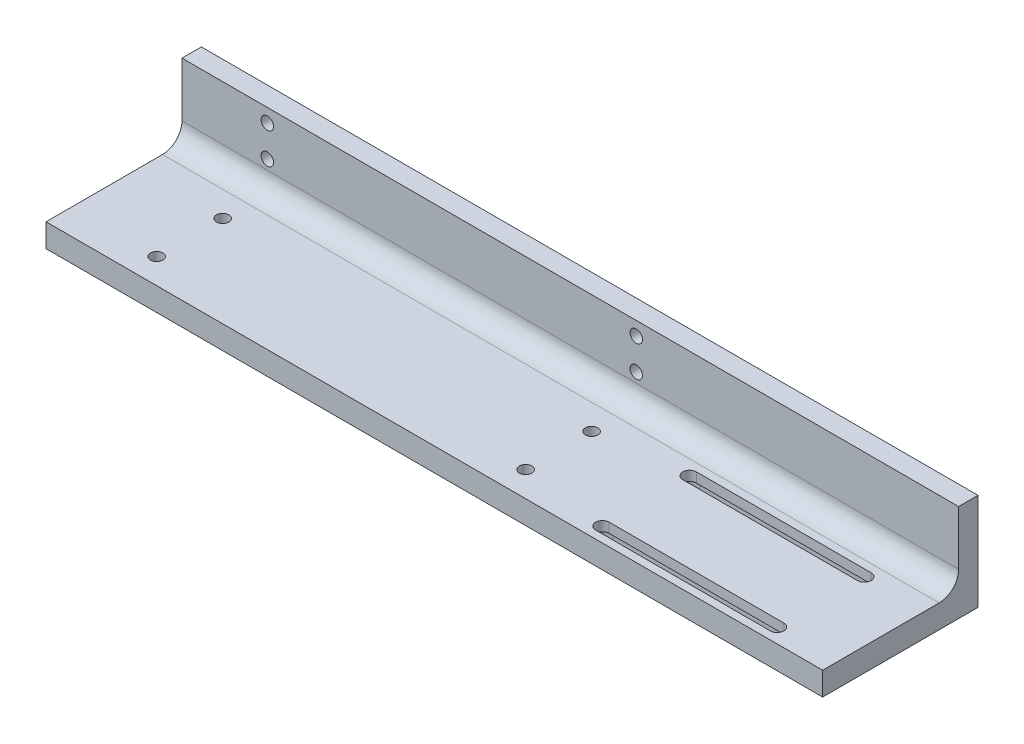
ISO-10303-21;
HEADER;
FILE_DESCRIPTION(('STEP AP214'),'2;1');
FILE_NAME('part.step','',(''),(''),'','','');
FILE_SCHEMA(('AUTOMOTIVE_DESIGN { 1 0 10303 214 1 1 1 1 }'));
ENDSEC;
DATA;
#1=APPLICATION_CONTEXT('core data for automotive mechanical design processes');
#2=APPLICATION_PROTOCOL_DEFINITION('international standard','automotive_design',2000,#1);
#3=PRODUCT_CONTEXT('',#1,'mechanical');
#4=PRODUCT('Part','Part','',(#3));
#5=PRODUCT_RELATED_PRODUCT_CATEGORY('part','',(#4));
#6=PRODUCT_DEFINITION_FORMATION('','',#4);
#7=PRODUCT_DEFINITION_CONTEXT('part definition',#1,'design');
#8=PRODUCT_DEFINITION('design','',#6,#7);
#9=PRODUCT_DEFINITION_SHAPE('','',#8);
#10=(LENGTH_UNIT() NAMED_UNIT(*) SI_UNIT(.MILLI.,.METRE.));
#11=(NAMED_UNIT(*) PLANE_ANGLE_UNIT() SI_UNIT($,.RADIAN.));
#12=(NAMED_UNIT(*) SI_UNIT($,.STERADIAN.) SOLID_ANGLE_UNIT());
#13=UNCERTAINTY_MEASURE_WITH_UNIT(LENGTH_MEASURE(1.E-05),#10,'distance_accuracy_value','');
#14=(GEOMETRIC_REPRESENTATION_CONTEXT(3) GLOBAL_UNCERTAINTY_ASSIGNED_CONTEXT((#13)) GLOBAL_UNIT_ASSIGNED_CONTEXT((#10,
#11,#12)) REPRESENTATION_CONTEXT('',''));
#15=CARTESIAN_POINT('',(0.,0.,0.));
#16=DIRECTION('',(0.,0.,1.));
#17=DIRECTION('',(1.,0.,0.));
#18=AXIS2_PLACEMENT_3D('',#15,#16,#17);
#19=CARTESIAN_POINT('',(200.,2.5,0.));
#20=DIRECTION('',(0.,0.,-1.));
#21=DIRECTION('',(-1.,0.,0.));
#22=AXIS2_PLACEMENT_3D('',#19,#20,#21);
#23=PLANE('',#22);
#24=DIRECTION('',(0.,-1.,0.));
#25=VECTOR('',#24,1.);
#26=CARTESIAN_POINT('',(0.,2.5,0.));
#27=LINE('',#26,#25);
#28=CARTESIAN_POINT('',(0.,2.5,0.));
#29=VERTEX_POINT('',#28);
#30=CARTESIAN_POINT('',(0.,-3.5,0.));
#31=VERTEX_POINT('',#30);
#32=EDGE_CURVE('E340',#29,#31,#27,.T.);
#33=ORIENTED_EDGE('',*,*,#32,.T.);
#34=DIRECTION('',(-1.,0.,0.));
#35=VECTOR('',#34,1.);
#36=CARTESIAN_POINT('',(200.,-3.5,0.));
#37=LINE('',#36,#35);
#38=CARTESIAN_POINT('',(200.,-3.5,0.));
#39=VERTEX_POINT('',#38);
#40=EDGE_CURVE('E11',#39,#31,#37,.T.);
#41=ORIENTED_EDGE('',*,*,#40,.F.);
#42=DIRECTION('',(0.,-1.,0.));
#43=VECTOR('',#42,1.);
#44=CARTESIAN_POINT('',(200.,2.5,0.));
#45=LINE('',#44,#43);
#46=CARTESIAN_POINT('',(200.,2.5,0.));
#47=VERTEX_POINT('',#46);
#48=EDGE_CURVE('E341',#47,#39,#45,.T.);
#49=ORIENTED_EDGE('',*,*,#48,.F.);
#50=DIRECTION('',(-1.,0.,0.));
#51=VECTOR('',#50,1.);
#52=CARTESIAN_POINT('',(200.,2.5,0.));
#53=LINE('',#52,#51);
#54=EDGE_CURVE('E357',#47,#29,#53,.T.);
#55=ORIENTED_EDGE('',*,*,#54,.T.);
#56=EDGE_LOOP('',(#33,#41,#49,#55));
#57=FACE_BOUND('',#56,.T.);
#58=ADVANCED_FACE('F33',(#57),#23,.F.);
#59=CARTESIAN_POINT('',(200.,-3.5,0.));
#60=DIRECTION('',(0.,1.,0.));
#61=DIRECTION('',(0.,0.,1.));
#62=AXIS2_PLACEMENT_3D('',#59,#60,#61);
#63=PLANE('',#62);
#64=DIRECTION('',(-1.,0.,0.));
#65=VECTOR('',#64,1.);
#66=CARTESIAN_POINT('',(184.5,-3.5,-23.475));
#67=LINE('',#66,#65);
#68=CARTESIAN_POINT('',(184.5,-3.5,-23.475));
#69=VERTEX_POINT('',#68);
#70=CARTESIAN_POINT('',(139.5,-3.5,-23.475));
#71=VERTEX_POINT('',#70);
#72=EDGE_CURVE('E234',#69,#71,#67,.T.);
#73=ORIENTED_EDGE('',*,*,#72,.F.);
#74=CARTESIAN_POINT('',(184.5,-3.5,-26.225));
#75=DIRECTION('',(0.,1.,0.));
#76=DIRECTION('',(0.,0.,1.));
#77=AXIS2_PLACEMENT_3D('',#74,#75,#76);
#78=CIRCLE('',#77,2.75);
#79=CARTESIAN_POINT('',(184.5,-3.5,-28.975));
#80=VERTEX_POINT('',#79);
#81=EDGE_CURVE('E237',#80,#69,#78,.F.);
#82=ORIENTED_EDGE('',*,*,#81,.F.);
#83=DIRECTION('',(1.,0.,0.));
#84=VECTOR('',#83,1.);
#85=CARTESIAN_POINT('',(184.5,-3.5,-28.975));
#86=LINE('',#85,#84);
#87=CARTESIAN_POINT('',(139.5,-3.5,-28.975));
#88=VERTEX_POINT('',#87);
#89=EDGE_CURVE('E231',#88,#80,#86,.T.);
#90=ORIENTED_EDGE('',*,*,#89,.F.);
#91=CARTESIAN_POINT('',(139.5,-3.5,-26.225));
#92=DIRECTION('',(0.,1.,0.));
#93=DIRECTION('',(0.,0.,1.));
#94=AXIS2_PLACEMENT_3D('',#91,#92,#93);
#95=CIRCLE('',#94,2.75);
#96=EDGE_CURVE('E232',#71,#88,#95,.F.);
#97=ORIENTED_EDGE('',*,*,#96,.F.);
#98=EDGE_LOOP('',(#73,#82,#90,#97));
#99=FACE_BOUND('',#98,.T.);
#100=CARTESIAN_POINT('',(117.,-3.5,-6.5));
#101=DIRECTION('',(0.,1.,0.));
#102=DIRECTION('',(0.,0.,1.));
#103=AXIS2_PLACEMENT_3D('',#100,#101,#102);
#104=CIRCLE('',#103,1.6);
#105=CARTESIAN_POINT('',(117.,-3.5,-4.9));
#106=VERTEX_POINT('',#105);
#107=EDGE_CURVE('E227',#106,#106,#104,.F.);
#108=ORIENTED_EDGE('',*,*,#107,.F.);
#109=EDGE_LOOP('',(#108));
#110=FACE_BOUND('',#109,.T.);
#111=CARTESIAN_POINT('',(117.,-3.5,-23.5));
#112=DIRECTION('',(0.,1.,0.));
#113=DIRECTION('',(0.,0.,1.));
#114=AXIS2_PLACEMENT_3D('',#111,#112,#113);
#115=CIRCLE('',#114,1.6);
#116=CARTESIAN_POINT('',(117.,-3.5,-21.9));
#117=VERTEX_POINT('',#116);
#118=EDGE_CURVE('E230',#117,#117,#115,.F.);
#119=ORIENTED_EDGE('',*,*,#118,.F.);
#120=EDGE_LOOP('',(#119));
#121=FACE_BOUND('',#120,.T.);
#122=CARTESIAN_POINT('',(22.,-3.5,-6.5));
#123=DIRECTION('',(0.,1.,0.));
#124=DIRECTION('',(0.,0.,1.));
#125=AXIS2_PLACEMENT_3D('',#122,#123,#124);
#126=CIRCLE('',#125,1.6);
#127=CARTESIAN_POINT('',(22.,-3.5,-4.9));
#128=VERTEX_POINT('',#127);
#129=EDGE_CURVE('E256',#128,#128,#126,.F.);
#130=ORIENTED_EDGE('',*,*,#129,.F.);
#131=EDGE_LOOP('',(#130));
#132=FACE_BOUND('',#131,.T.);
#133=DIRECTION('',(-1.,0.,0.));
#134=VECTOR('',#133,1.);
#135=CARTESIAN_POINT('',(184.5,-3.5,-1.02500000000003));
#136=LINE('',#135,#134);
#137=CARTESIAN_POINT('',(184.5,-3.5,-1.02500000000003));
#138=VERTEX_POINT('',#137);
#139=CARTESIAN_POINT('',(139.5,-3.5,-1.02500000000003));
#140=VERTEX_POINT('',#139);
#141=EDGE_CURVE('E773',#138,#140,#136,.T.);
#142=ORIENTED_EDGE('',*,*,#141,.F.);
#143=CARTESIAN_POINT('',(184.5,-3.5,-3.77500000000003));
#144=DIRECTION('',(0.,1.,0.));
#145=DIRECTION('',(0.,0.,1.));
#146=AXIS2_PLACEMENT_3D('',#143,#144,#145);
#147=CIRCLE('',#146,2.75);
#148=CARTESIAN_POINT('',(184.5,-3.5,-6.52500000000004));
#149=VERTEX_POINT('',#148);
#150=EDGE_CURVE('E215',#149,#138,#147,.F.);
#151=ORIENTED_EDGE('',*,*,#150,.F.);
#152=DIRECTION('',(1.,0.,0.));
#153=VECTOR('',#152,1.);
#154=CARTESIAN_POINT('',(184.5,-3.5,-6.52500000000004));
#155=LINE('',#154,#153);
#156=CARTESIAN_POINT('',(139.5,-3.5,-6.52500000000003));
#157=VERTEX_POINT('',#156);
#158=EDGE_CURVE('E190',#157,#149,#155,.T.);
#159=ORIENTED_EDGE('',*,*,#158,.F.);
#160=CARTESIAN_POINT('',(139.5,-3.5,-3.77500000000003));
#161=DIRECTION('',(0.,1.,0.));
#162=DIRECTION('',(0.,0.,1.));
#163=AXIS2_PLACEMENT_3D('',#160,#161,#162);
#164=CIRCLE('',#163,2.75);
#165=EDGE_CURVE('E221',#140,#157,#164,.F.);
#166=ORIENTED_EDGE('',*,*,#165,.F.);
#167=EDGE_LOOP('',(#142,#151,#159,#166));
#168=FACE_BOUND('',#167,.T.);
#169=CARTESIAN_POINT('',(22.,-3.5,-23.5));
#170=DIRECTION('',(0.,1.,0.));
#171=DIRECTION('',(0.,0.,1.));
#172=AXIS2_PLACEMENT_3D('',#169,#170,#171);
#173=CIRCLE('',#172,1.59999999999999);
#174=CARTESIAN_POINT('',(22.,-3.5,-21.9));
#175=VERTEX_POINT('',#174);
#176=EDGE_CURVE('E259',#175,#175,#173,.F.);
#177=ORIENTED_EDGE('',*,*,#176,.F.);
#178=EDGE_LOOP('',(#177));
#179=FACE_BOUND('',#178,.T.);
#180=DIRECTION('',(0.,0.,-1.));
#181=VECTOR('',#180,1.);
#182=CARTESIAN_POINT('',(0.,-3.5,0.));
#183=LINE('',#182,#181);
#184=CARTESIAN_POINT('',(0.,-3.5,-40.));
#185=VERTEX_POINT('',#184);
#186=EDGE_CURVE('E360',#31,#185,#183,.T.);
#187=ORIENTED_EDGE('',*,*,#186,.T.);
#188=DIRECTION('',(-1.,0.,0.));
#189=VECTOR('',#188,1.);
#190=CARTESIAN_POINT('',(200.,-3.5,-40.));
#191=LINE('',#190,#189);
#192=CARTESIAN_POINT('',(200.,-3.5,-40.));
#193=VERTEX_POINT('',#192);
#194=EDGE_CURVE('E40',#193,#185,#191,.T.);
#195=ORIENTED_EDGE('',*,*,#194,.F.);
#196=DIRECTION('',(0.,0.,-1.));
#197=VECTOR('',#196,1.);
#198=CARTESIAN_POINT('',(200.,-3.5,0.));
#199=LINE('',#198,#197);
#200=EDGE_CURVE('E344',#39,#193,#199,.T.);
#201=ORIENTED_EDGE('',*,*,#200,.F.);
#202=ORIENTED_EDGE('',*,*,#40,.T.);
#203=EDGE_LOOP('',(#187,#195,#201,#202));
#204=FACE_BOUND('',#203,.T.);
#205=ADVANCED_FACE('F412',(#99,#110,#121,#132,#168,#179,#204),#63,.F.);
#206=CARTESIAN_POINT('',(200.,-3.5,-40.));
#207=DIRECTION('',(0.,0.,1.));
#208=DIRECTION('',(1.,0.,0.));
#209=AXIS2_PLACEMENT_3D('',#206,#207,#208);
#210=PLANE('',#209);
#211=CARTESIAN_POINT('',(22.,18.,-40.));
#212=DIRECTION('',(0.,0.,1.));
#213=DIRECTION('',(1.,0.,0.));
#214=AXIS2_PLACEMENT_3D('',#211,#212,#213);
#215=CIRCLE('',#214,1.6);
#216=CARTESIAN_POINT('',(23.6,18.,-40.));
#217=VERTEX_POINT('',#216);
#218=EDGE_CURVE('E781',#217,#217,#215,.F.);
#219=ORIENTED_EDGE('',*,*,#218,.F.);
#220=EDGE_LOOP('',(#219));
#221=FACE_BOUND('',#220,.T.);
#222=CARTESIAN_POINT('',(117.,10.,-40.));
#223=DIRECTION('',(0.,0.,1.));
#224=DIRECTION('',(1.,0.,0.));
#225=AXIS2_PLACEMENT_3D('',#222,#223,#224);
#226=CIRCLE('',#225,1.6);
#227=CARTESIAN_POINT('',(118.6,10.,-40.));
#228=VERTEX_POINT('',#227);
#229=EDGE_CURVE('E782',#228,#228,#226,.F.);
#230=ORIENTED_EDGE('',*,*,#229,.F.);
#231=EDGE_LOOP('',(#230));
#232=FACE_BOUND('',#231,.T.);
#233=CARTESIAN_POINT('',(117.,18.,-40.));
#234=DIRECTION('',(0.,0.,1.));
#235=DIRECTION('',(1.,0.,0.));
#236=AXIS2_PLACEMENT_3D('',#233,#234,#235);
#237=CIRCLE('',#236,1.6);
#238=CARTESIAN_POINT('',(118.6,18.,-40.));
#239=VERTEX_POINT('',#238);
#240=EDGE_CURVE('E789',#239,#239,#237,.F.);
#241=ORIENTED_EDGE('',*,*,#240,.F.);
#242=EDGE_LOOP('',(#241));
#243=FACE_BOUND('',#242,.T.);
#244=CARTESIAN_POINT('',(22.,10.,-40.));
#245=DIRECTION('',(0.,0.,1.));
#246=DIRECTION('',(1.,0.,0.));
#247=AXIS2_PLACEMENT_3D('',#244,#245,#246);
#248=CIRCLE('',#247,1.6);
#249=CARTESIAN_POINT('',(23.6,10.,-40.));
#250=VERTEX_POINT('',#249);
#251=EDGE_CURVE('E209',#250,#250,#248,.F.);
#252=ORIENTED_EDGE('',*,*,#251,.F.);
#253=EDGE_LOOP('',(#252));
#254=FACE_BOUND('',#253,.T.);
#255=DIRECTION('',(0.,1.,0.));
#256=VECTOR('',#255,1.);
#257=CARTESIAN_POINT('',(0.,-3.5,-40.));
#258=LINE('',#257,#256);
#259=CARTESIAN_POINT('',(0.,21.5,-40.));
#260=VERTEX_POINT('',#259);
#261=EDGE_CURVE('E362',#185,#260,#258,.T.);
#262=ORIENTED_EDGE('',*,*,#261,.T.);
#263=DIRECTION('',(-1.,0.,0.));
#264=VECTOR('',#263,1.);
#265=CARTESIAN_POINT('',(200.,21.5,-40.));
#266=LINE('',#265,#264);
#267=CARTESIAN_POINT('',(200.,21.5,-40.));
#268=VERTEX_POINT('',#267);
#269=EDGE_CURVE('E382',#268,#260,#266,.T.);
#270=ORIENTED_EDGE('',*,*,#269,.F.);
#271=DIRECTION('',(0.,1.,0.));
#272=VECTOR('',#271,1.);
#273=CARTESIAN_POINT('',(200.,-3.5,-40.));
#274=LINE('',#273,#272);
#275=EDGE_CURVE('E347',#193,#268,#274,.T.);
#276=ORIENTED_EDGE('',*,*,#275,.F.);
#277=ORIENTED_EDGE('',*,*,#194,.T.);
#278=EDGE_LOOP('',(#262,#270,#276,#277));
#279=FACE_BOUND('',#278,.T.);
#280=ADVANCED_FACE('F389',(#221,#232,#243,#254,#279),#210,.F.);
#281=CARTESIAN_POINT('',(200.,21.5,-35.));
#282=DIRECTION('',(0.,-1.,0.));
#283=DIRECTION('',(0.,0.,-1.));
#284=AXIS2_PLACEMENT_3D('',#281,#282,#283);
#285=PLANE('',#284);
#286=DIRECTION('',(0.,0.,1.));
#287=VECTOR('',#286,1.);
#288=CARTESIAN_POINT('',(0.,21.5,-35.));
#289=LINE('',#288,#287);
#290=CARTESIAN_POINT('',(0.,21.5,-35.));
#291=VERTEX_POINT('',#290);
#292=EDGE_CURVE('E364',#260,#291,#289,.T.);
#293=ORIENTED_EDGE('',*,*,#292,.T.);
#294=DIRECTION('',(-1.,0.,0.));
#295=VECTOR('',#294,1.);
#296=CARTESIAN_POINT('',(200.,21.5,-35.));
#297=LINE('',#296,#295);
#298=CARTESIAN_POINT('',(200.,21.5,-35.));
#299=VERTEX_POINT('',#298);
#300=EDGE_CURVE('E379',#299,#291,#297,.T.);
#301=ORIENTED_EDGE('',*,*,#300,.F.);
#302=DIRECTION('',(0.,0.,1.));
#303=VECTOR('',#302,1.);
#304=CARTESIAN_POINT('',(200.,21.5,-35.));
#305=LINE('',#304,#303);
#306=EDGE_CURVE('E349',#268,#299,#305,.T.);
#307=ORIENTED_EDGE('',*,*,#306,.F.);
#308=ORIENTED_EDGE('',*,*,#269,.T.);
#309=EDGE_LOOP('',(#293,#301,#307,#308));
#310=FACE_BOUND('',#309,.T.);
#311=ADVANCED_FACE('F400',(#310),#285,.F.);
#312=CARTESIAN_POINT('',(200.,7.50000000000004,-35.));
#313=DIRECTION('',(0.,0.,-1.));
#314=DIRECTION('',(-1.,0.,0.));
#315=AXIS2_PLACEMENT_3D('',#312,#313,#314);
#316=PLANE('',#315);
#317=CARTESIAN_POINT('',(22.,18.,-35.));
#318=DIRECTION('',(0.,0.,1.));
#319=DIRECTION('',(1.,0.,0.));
#320=AXIS2_PLACEMENT_3D('',#317,#318,#319);
#321=CIRCLE('',#320,1.6);
#322=CARTESIAN_POINT('',(23.6,18.,-35.));
#323=VERTEX_POINT('',#322);
#324=EDGE_CURVE('E785',#323,#323,#321,.T.);
#325=ORIENTED_EDGE('',*,*,#324,.F.);
#326=EDGE_LOOP('',(#325));
#327=FACE_BOUND('',#326,.T.);
#328=CARTESIAN_POINT('',(117.,10.,-35.));
#329=DIRECTION('',(0.,0.,1.));
#330=DIRECTION('',(1.,0.,0.));
#331=AXIS2_PLACEMENT_3D('',#328,#329,#330);
#332=CIRCLE('',#331,1.6);
#333=CARTESIAN_POINT('',(118.6,10.,-35.));
#334=VERTEX_POINT('',#333);
#335=EDGE_CURVE('E786',#334,#334,#332,.T.);
#336=ORIENTED_EDGE('',*,*,#335,.F.);
#337=EDGE_LOOP('',(#336));
#338=FACE_BOUND('',#337,.T.);
#339=CARTESIAN_POINT('',(117.,18.,-35.));
#340=DIRECTION('',(0.,0.,1.));
#341=DIRECTION('',(1.,0.,0.));
#342=AXIS2_PLACEMENT_3D('',#339,#340,#341);
#343=CIRCLE('',#342,1.6);
#344=CARTESIAN_POINT('',(118.6,18.,-35.));
#345=VERTEX_POINT('',#344);
#346=EDGE_CURVE('E795',#345,#345,#343,.T.);
#347=ORIENTED_EDGE('',*,*,#346,.F.);
#348=EDGE_LOOP('',(#347));
#349=FACE_BOUND('',#348,.T.);
#350=CARTESIAN_POINT('',(22.,10.,-35.));
#351=DIRECTION('',(0.,0.,1.));
#352=DIRECTION('',(1.,0.,0.));
#353=AXIS2_PLACEMENT_3D('',#350,#351,#352);
#354=CIRCLE('',#353,1.6);
#355=CARTESIAN_POINT('',(23.6,10.,-35.));
#356=VERTEX_POINT('',#355);
#357=EDGE_CURVE('E212',#356,#356,#354,.T.);
#358=ORIENTED_EDGE('',*,*,#357,.F.);
#359=EDGE_LOOP('',(#358));
#360=FACE_BOUND('',#359,.T.);
#361=DIRECTION('',(0.,-1.,0.));
#362=VECTOR('',#361,1.);
#363=CARTESIAN_POINT('',(0.,7.50000000000004,-35.));
#364=LINE('',#363,#362);
#365=CARTESIAN_POINT('',(0.,7.5,-35.));
#366=VERTEX_POINT('',#365);
#367=EDGE_CURVE('E366',#291,#366,#364,.T.);
#368=ORIENTED_EDGE('',*,*,#367,.T.);
#369=DIRECTION('',(-1.,0.,0.));
#370=VECTOR('',#369,1.);
#371=CARTESIAN_POINT('',(200.,7.5,-35.));
#372=LINE('',#371,#370);
#373=CARTESIAN_POINT('',(200.,7.5,-35.));
#374=VERTEX_POINT('',#373);
#375=EDGE_CURVE('E376',#374,#366,#372,.T.);
#376=ORIENTED_EDGE('',*,*,#375,.F.);
#377=DIRECTION('',(0.,-1.,0.));
#378=VECTOR('',#377,1.);
#379=CARTESIAN_POINT('',(200.,7.50000000000004,-35.));
#380=LINE('',#379,#378);
#381=EDGE_CURVE('E351',#299,#374,#380,.T.);
#382=ORIENTED_EDGE('',*,*,#381,.F.);
#383=ORIENTED_EDGE('',*,*,#300,.T.);
#384=EDGE_LOOP('',(#368,#376,#382,#383));
#385=FACE_BOUND('',#384,.T.);
#386=ADVANCED_FACE('F404',(#327,#338,#349,#360,#385),#316,.F.);
#387=CARTESIAN_POINT('',(200.,7.5,-30.));
#388=DIRECTION('',(-1.,0.,0.));
#389=DIRECTION('',(0.,0.,1.));
#390=AXIS2_PLACEMENT_3D('',#387,#388,#389);
#391=CYLINDRICAL_SURFACE('',#390,5.);
#392=CARTESIAN_POINT('',(0.,7.5,-30.));
#393=DIRECTION('',(-1.,0.,0.));
#394=DIRECTION('',(0.,0.,-1.));
#395=AXIS2_PLACEMENT_3D('',#392,#393,#394);
#396=CIRCLE('',#395,5.);
#397=CARTESIAN_POINT('',(0.,2.5,-30.));
#398=VERTEX_POINT('',#397);
#399=EDGE_CURVE('E368',#366,#398,#396,.T.);
#400=ORIENTED_EDGE('',*,*,#399,.T.);
#401=DIRECTION('',(-1.,0.,0.));
#402=VECTOR('',#401,1.);
#403=CARTESIAN_POINT('',(200.,2.5,-30.));
#404=LINE('',#403,#402);
#405=CARTESIAN_POINT('',(200.,2.5,-30.));
#406=VERTEX_POINT('',#405);
#407=EDGE_CURVE('E373',#406,#398,#404,.T.);
#408=ORIENTED_EDGE('',*,*,#407,.F.);
#409=CARTESIAN_POINT('',(200.,7.5,-30.));
#410=DIRECTION('',(-1.,0.,0.));
#411=DIRECTION('',(0.,0.,-1.));
#412=AXIS2_PLACEMENT_3D('',#409,#410,#411);
#413=CIRCLE('',#412,5.);
#414=EDGE_CURVE('E353',#374,#406,#413,.T.);
#415=ORIENTED_EDGE('',*,*,#414,.F.);
#416=ORIENTED_EDGE('',*,*,#375,.T.);
#417=EDGE_LOOP('',(#400,#408,#415,#416));
#418=FACE_BOUND('',#417,.T.);
#419=ADVANCED_FACE('F420',(#418),#391,.F.);
#420=CARTESIAN_POINT('',(200.,2.5,0.));
#421=DIRECTION('',(0.,-1.,0.));
#422=DIRECTION('',(0.,0.,-1.));
#423=AXIS2_PLACEMENT_3D('',#420,#421,#422);
#424=PLANE('',#423);
#425=DIRECTION('',(1.,0.,0.));
#426=VECTOR('',#425,1.);
#427=CARTESIAN_POINT('',(139.5,2.5,-27.975));
#428=LINE('',#427,#426);
#429=CARTESIAN_POINT('',(139.5,2.5,-27.975));
#430=VERTEX_POINT('',#429);
#431=CARTESIAN_POINT('',(184.5,2.5,-27.975));
#432=VERTEX_POINT('',#431);
#433=EDGE_CURVE('E306',#430,#432,#428,.T.);
#434=ORIENTED_EDGE('',*,*,#433,.T.);
#435=CARTESIAN_POINT('',(184.5,2.5,-26.225));
#436=DIRECTION('',(0.,-1.,0.));
#437=DIRECTION('',(0.,0.,-1.));
#438=AXIS2_PLACEMENT_3D('',#435,#436,#437);
#439=CIRCLE('',#438,1.75000000000001);
#440=CARTESIAN_POINT('',(184.5,2.5,-24.475));
#441=VERTEX_POINT('',#440);
#442=EDGE_CURVE('E302',#432,#441,#439,.T.);
#443=ORIENTED_EDGE('',*,*,#442,.T.);
#444=DIRECTION('',(-1.,0.,0.));
#445=VECTOR('',#444,1.);
#446=CARTESIAN_POINT('',(139.5,2.5,-24.475));
#447=LINE('',#446,#445);
#448=CARTESIAN_POINT('',(139.5,2.5,-24.475));
#449=VERTEX_POINT('',#448);
#450=EDGE_CURVE('E305',#441,#449,#447,.T.);
#451=ORIENTED_EDGE('',*,*,#450,.T.);
#452=CARTESIAN_POINT('',(139.5,2.5,-26.225));
#453=DIRECTION('',(0.,-1.,0.));
#454=DIRECTION('',(0.,0.,-1.));
#455=AXIS2_PLACEMENT_3D('',#452,#453,#454);
#456=CIRCLE('',#455,1.75);
#457=EDGE_CURVE('E301',#449,#430,#456,.T.);
#458=ORIENTED_EDGE('',*,*,#457,.T.);
#459=EDGE_LOOP('',(#434,#443,#451,#458));
#460=FACE_BOUND('',#459,.T.);
#461=CARTESIAN_POINT('',(117.,2.5,-6.5));
#462=DIRECTION('',(0.,-1.,0.));
#463=DIRECTION('',(0.,0.,-1.));
#464=AXIS2_PLACEMENT_3D('',#461,#462,#463);
#465=CIRCLE('',#464,1.60000000000001);
#466=CARTESIAN_POINT('',(117.,2.5,-8.10000000000001));
#467=VERTEX_POINT('',#466);
#468=EDGE_CURVE('E297',#467,#467,#465,.T.);
#469=ORIENTED_EDGE('',*,*,#468,.T.);
#470=EDGE_LOOP('',(#469));
#471=FACE_BOUND('',#470,.T.);
#472=CARTESIAN_POINT('',(22.,2.5,-23.5));
#473=DIRECTION('',(0.,-1.,0.));
#474=DIRECTION('',(0.,0.,-1.));
#475=AXIS2_PLACEMENT_3D('',#472,#473,#474);
#476=CIRCLE('',#475,1.6);
#477=CARTESIAN_POINT('',(22.,2.5,-25.1));
#478=VERTEX_POINT('',#477);
#479=EDGE_CURVE('E300',#478,#478,#476,.T.);
#480=ORIENTED_EDGE('',*,*,#479,.T.);
#481=EDGE_LOOP('',(#480));
#482=FACE_BOUND('',#481,.T.);
#483=CARTESIAN_POINT('',(117.,2.5,-23.5));
#484=DIRECTION('',(0.,-1.,0.));
#485=DIRECTION('',(0.,0.,-1.));
#486=AXIS2_PLACEMENT_3D('',#483,#484,#485);
#487=CIRCLE('',#486,1.6);
#488=CARTESIAN_POINT('',(117.,2.5,-25.1));
#489=VERTEX_POINT('',#488);
#490=EDGE_CURVE('E332',#489,#489,#487,.T.);
#491=ORIENTED_EDGE('',*,*,#490,.T.);
#492=EDGE_LOOP('',(#491));
#493=FACE_BOUND('',#492,.T.);
#494=DIRECTION('',(1.,0.,0.));
#495=VECTOR('',#494,1.);
#496=CARTESIAN_POINT('',(139.5,2.5,-5.52500000000003));
#497=LINE('',#496,#495);
#498=CARTESIAN_POINT('',(139.5,2.5,-5.52500000000003));
#499=VERTEX_POINT('',#498);
#500=CARTESIAN_POINT('',(184.5,2.5,-5.52500000000003));
#501=VERTEX_POINT('',#500);
#502=EDGE_CURVE('E269',#499,#501,#497,.T.);
#503=ORIENTED_EDGE('',*,*,#502,.T.);
#504=CARTESIAN_POINT('',(184.5,2.5,-3.77500000000004));
#505=DIRECTION('',(0.,-1.,0.));
#506=DIRECTION('',(0.,0.,-1.));
#507=AXIS2_PLACEMENT_3D('',#504,#505,#506);
#508=CIRCLE('',#507,1.75);
#509=CARTESIAN_POINT('',(184.5,2.5,-2.02500000000004));
#510=VERTEX_POINT('',#509);
#511=EDGE_CURVE('E265',#501,#510,#508,.T.);
#512=ORIENTED_EDGE('',*,*,#511,.T.);
#513=DIRECTION('',(-1.,0.,0.));
#514=VECTOR('',#513,1.);
#515=CARTESIAN_POINT('',(139.5,2.5,-2.02500000000003));
#516=LINE('',#515,#514);
#517=CARTESIAN_POINT('',(139.5,2.5,-2.02500000000003));
#518=VERTEX_POINT('',#517);
#519=EDGE_CURVE('E268',#510,#518,#516,.T.);
#520=ORIENTED_EDGE('',*,*,#519,.T.);
#521=CARTESIAN_POINT('',(139.5,2.5,-3.77500000000003));
#522=DIRECTION('',(0.,-1.,0.));
#523=DIRECTION('',(0.,0.,-1.));
#524=AXIS2_PLACEMENT_3D('',#521,#522,#523);
#525=CIRCLE('',#524,1.75);
#526=EDGE_CURVE('E272',#518,#499,#525,.T.);
#527=ORIENTED_EDGE('',*,*,#526,.T.);
#528=EDGE_LOOP('',(#503,#512,#520,#527));
#529=FACE_BOUND('',#528,.T.);
#530=CARTESIAN_POINT('',(22.,2.5,-6.5));
#531=DIRECTION('',(0.,-1.,0.));
#532=DIRECTION('',(0.,0.,-1.));
#533=AXIS2_PLACEMENT_3D('',#530,#531,#532);
#534=CIRCLE('',#533,1.6);
#535=CARTESIAN_POINT('',(22.,2.5,-8.1));
#536=VERTEX_POINT('',#535);
#537=EDGE_CURVE('E335',#536,#536,#534,.T.);
#538=ORIENTED_EDGE('',*,*,#537,.T.);
#539=EDGE_LOOP('',(#538));
#540=FACE_BOUND('',#539,.T.);
#541=DIRECTION('',(0.,0.,1.));
#542=VECTOR('',#541,1.);
#543=CARTESIAN_POINT('',(0.,2.5,0.));
#544=LINE('',#543,#542);
#545=EDGE_CURVE('E345',#398,#29,#544,.T.);
#546=ORIENTED_EDGE('',*,*,#545,.T.);
#547=ORIENTED_EDGE('',*,*,#54,.F.);
#548=DIRECTION('',(0.,0.,1.));
#549=VECTOR('',#548,1.);
#550=CARTESIAN_POINT('',(200.,2.5,0.));
#551=LINE('',#550,#549);
#552=EDGE_CURVE('E355',#406,#47,#551,.T.);
#553=ORIENTED_EDGE('',*,*,#552,.F.);
#554=ORIENTED_EDGE('',*,*,#407,.T.);
#555=EDGE_LOOP('',(#546,#547,#553,#554));
#556=FACE_BOUND('',#555,.T.);
#557=ADVANCED_FACE('F417',(#460,#471,#482,#493,#529,#540,#556),#424,.F.);
#558=CARTESIAN_POINT('',(200.,7.5,-30.));
#559=DIRECTION('',(1.,0.,0.));
#560=DIRECTION('',(0.,0.,-1.));
#561=AXIS2_PLACEMENT_3D('',#558,#559,#560);
#562=PLANE('',#561);
#563=ORIENTED_EDGE('',*,*,#48,.T.);
#564=ORIENTED_EDGE('',*,*,#200,.T.);
#565=ORIENTED_EDGE('',*,*,#275,.T.);
#566=ORIENTED_EDGE('',*,*,#306,.T.);
#567=ORIENTED_EDGE('',*,*,#381,.T.);
#568=ORIENTED_EDGE('',*,*,#414,.T.);
#569=ORIENTED_EDGE('',*,*,#552,.T.);
#570=EDGE_LOOP('',(#563,#564,#565,#566,#567,#568,#569));
#571=FACE_BOUND('',#570,.T.);
#572=ADVANCED_FACE('F408',(#571),#562,.T.);
#573=CARTESIAN_POINT('',(0.,7.5,-30.));
#574=DIRECTION('',(1.,0.,0.));
#575=DIRECTION('',(0.,0.,-1.));
#576=AXIS2_PLACEMENT_3D('',#573,#574,#575);
#577=PLANE('',#576);
#578=ORIENTED_EDGE('',*,*,#32,.F.);
#579=ORIENTED_EDGE('',*,*,#545,.F.);
#580=ORIENTED_EDGE('',*,*,#399,.F.);
#581=ORIENTED_EDGE('',*,*,#367,.F.);
#582=ORIENTED_EDGE('',*,*,#292,.F.);
#583=ORIENTED_EDGE('',*,*,#261,.F.);
#584=ORIENTED_EDGE('',*,*,#186,.F.);
#585=EDGE_LOOP('',(#578,#579,#580,#581,#582,#583,#584));
#586=FACE_BOUND('',#585,.T.);
#587=ADVANCED_FACE('F395',(#586),#577,.F.);
#588=CARTESIAN_POINT('',(22.,51.1261246656568,-6.5));
#589=DIRECTION('',(0.,-1.,0.));
#590=DIRECTION('',(0.,0.,-1.));
#591=AXIS2_PLACEMENT_3D('',#588,#589,#590);
#592=CYLINDRICAL_SURFACE('',#591,1.6);
#593=ORIENTED_EDGE('',*,*,#537,.F.);
#594=EDGE_LOOP('',(#593));
#595=FACE_BOUND('',#594,.T.);
#596=ORIENTED_EDGE('',*,*,#129,.T.);
#597=EDGE_LOOP('',(#596));
#598=FACE_BOUND('',#597,.T.);
#599=ADVANCED_FACE('F544',(#595,#598),#592,.F.);
#600=CARTESIAN_POINT('',(139.5,51.1261246656568,-5.52500000000003));
#601=DIRECTION('',(0.,0.,1.));
#602=DIRECTION('',(1.,0.,0.));
#603=AXIS2_PLACEMENT_3D('',#600,#601,#602);
#604=PLANE('',#603);
#605=DIRECTION('',(0.,-1.,0.));
#606=VECTOR('',#605,1.);
#607=CARTESIAN_POINT('',(139.5,51.1261246656568,-5.52500000000003));
#608=LINE('',#607,#606);
#609=CARTESIAN_POINT('',(139.5,0.,-5.52500000000003));
#610=VERTEX_POINT('',#609);
#611=EDGE_CURVE('E283',#499,#610,#608,.T.);
#612=ORIENTED_EDGE('',*,*,#611,.T.);
#613=DIRECTION('',(-1.,0.,0.));
#614=VECTOR('',#613,1.);
#615=CARTESIAN_POINT('',(139.5,0.,-5.52500000000003));
#616=LINE('',#615,#614);
#617=CARTESIAN_POINT('',(184.5,0.,-5.52500000000003));
#618=VERTEX_POINT('',#617);
#619=EDGE_CURVE('E281',#618,#610,#616,.T.);
#620=ORIENTED_EDGE('',*,*,#619,.F.);
#621=DIRECTION('',(0.,-1.,0.));
#622=VECTOR('',#621,1.);
#623=CARTESIAN_POINT('',(184.5,51.1261246656568,-5.52500000000003));
#624=LINE('',#623,#622);
#625=EDGE_CURVE('E286',#501,#618,#624,.T.);
#626=ORIENTED_EDGE('',*,*,#625,.F.);
#627=ORIENTED_EDGE('',*,*,#502,.F.);
#628=EDGE_LOOP('',(#612,#620,#626,#627));
#629=FACE_BOUND('',#628,.T.);
#630=ADVANCED_FACE('F540',(#629),#604,.T.);
#631=CARTESIAN_POINT('',(184.5,51.1261246656568,-3.77500000000004));
#632=DIRECTION('',(0.,-1.,0.));
#633=DIRECTION('',(0.,0.,-1.));
#634=AXIS2_PLACEMENT_3D('',#631,#632,#633);
#635=CYLINDRICAL_SURFACE('',#634,1.75);
#636=ORIENTED_EDGE('',*,*,#625,.T.);
#637=CARTESIAN_POINT('',(184.5,0.,-3.77500000000004));
#638=DIRECTION('',(0.,1.,0.));
#639=DIRECTION('',(0.,0.,1.));
#640=AXIS2_PLACEMENT_3D('',#637,#638,#639);
#641=CIRCLE('',#640,1.75);
#642=CARTESIAN_POINT('',(184.5,0.,-2.02500000000004));
#643=VERTEX_POINT('',#642);
#644=EDGE_CURVE('E279',#643,#618,#641,.T.);
#645=ORIENTED_EDGE('',*,*,#644,.F.);
#646=DIRECTION('',(0.,-1.,0.));
#647=VECTOR('',#646,1.);
#648=CARTESIAN_POINT('',(184.5,51.1261246656568,-2.02500000000004));
#649=LINE('',#648,#647);
#650=EDGE_CURVE('E289',#510,#643,#649,.T.);
#651=ORIENTED_EDGE('',*,*,#650,.F.);
#652=ORIENTED_EDGE('',*,*,#511,.F.);
#653=EDGE_LOOP('',(#636,#645,#651,#652));
#654=FACE_BOUND('',#653,.T.);
#655=ADVANCED_FACE('F543',(#654),#635,.F.);
#656=CARTESIAN_POINT('',(139.5,51.1261246656568,-2.02500000000003));
#657=DIRECTION('',(0.,0.,-1.));
#658=DIRECTION('',(-1.,0.,0.));
#659=AXIS2_PLACEMENT_3D('',#656,#657,#658);
#660=PLANE('',#659);
#661=ORIENTED_EDGE('',*,*,#650,.T.);
#662=DIRECTION('',(1.,0.,0.));
#663=VECTOR('',#662,1.);
#664=CARTESIAN_POINT('',(139.5,0.,-2.02500000000003));
#665=LINE('',#664,#663);
#666=CARTESIAN_POINT('',(139.5,0.,-2.02500000000003));
#667=VERTEX_POINT('',#666);
#668=EDGE_CURVE('E277',#667,#643,#665,.T.);
#669=ORIENTED_EDGE('',*,*,#668,.F.);
#670=DIRECTION('',(0.,-1.,0.));
#671=VECTOR('',#670,1.);
#672=CARTESIAN_POINT('',(139.5,51.1261246656568,-2.02500000000003));
#673=LINE('',#672,#671);
#674=EDGE_CURVE('E292',#518,#667,#673,.T.);
#675=ORIENTED_EDGE('',*,*,#674,.F.);
#676=ORIENTED_EDGE('',*,*,#519,.F.);
#677=EDGE_LOOP('',(#661,#669,#675,#676));
#678=FACE_BOUND('',#677,.T.);
#679=ADVANCED_FACE('F548',(#678),#660,.T.);
#680=CARTESIAN_POINT('',(139.5,51.1261246656568,-3.77500000000003));
#681=DIRECTION('',(0.,-1.,0.));
#682=DIRECTION('',(0.,0.,-1.));
#683=AXIS2_PLACEMENT_3D('',#680,#681,#682);
#684=CYLINDRICAL_SURFACE('',#683,1.75);
#685=ORIENTED_EDGE('',*,*,#674,.T.);
#686=CARTESIAN_POINT('',(139.5,0.,-3.77500000000003));
#687=DIRECTION('',(0.,1.,0.));
#688=DIRECTION('',(0.,0.,1.));
#689=AXIS2_PLACEMENT_3D('',#686,#687,#688);
#690=CIRCLE('',#689,1.75);
#691=EDGE_CURVE('E264',#610,#667,#690,.T.);
#692=ORIENTED_EDGE('',*,*,#691,.F.);
#693=ORIENTED_EDGE('',*,*,#611,.F.);
#694=ORIENTED_EDGE('',*,*,#526,.F.);
#695=EDGE_LOOP('',(#685,#692,#693,#694));
#696=FACE_BOUND('',#695,.T.);
#697=ADVANCED_FACE('F552',(#696),#684,.F.);
#698=CARTESIAN_POINT('',(117.,51.1261246656568,-23.5));
#699=DIRECTION('',(0.,-1.,0.));
#700=DIRECTION('',(0.,0.,-1.));
#701=AXIS2_PLACEMENT_3D('',#698,#699,#700);
#702=CYLINDRICAL_SURFACE('',#701,1.6);
#703=ORIENTED_EDGE('',*,*,#490,.F.);
#704=EDGE_LOOP('',(#703));
#705=FACE_BOUND('',#704,.T.);
#706=ORIENTED_EDGE('',*,*,#118,.T.);
#707=EDGE_LOOP('',(#706));
#708=FACE_BOUND('',#707,.T.);
#709=ADVANCED_FACE('F556',(#705,#708),#702,.F.);
#710=CARTESIAN_POINT('',(22.,51.1261246656568,-23.5));
#711=DIRECTION('',(0.,-1.,0.));
#712=DIRECTION('',(0.,0.,-1.));
#713=AXIS2_PLACEMENT_3D('',#710,#711,#712);
#714=CYLINDRICAL_SURFACE('',#713,1.6);
#715=ORIENTED_EDGE('',*,*,#479,.F.);
#716=EDGE_LOOP('',(#715));
#717=FACE_BOUND('',#716,.T.);
#718=ORIENTED_EDGE('',*,*,#176,.T.);
#719=EDGE_LOOP('',(#718));
#720=FACE_BOUND('',#719,.T.);
#721=ADVANCED_FACE('F562',(#717,#720),#714,.F.);
#722=CARTESIAN_POINT('',(117.,51.1261246656568,-6.5));
#723=DIRECTION('',(0.,-1.,0.));
#724=DIRECTION('',(0.,0.,-1.));
#725=AXIS2_PLACEMENT_3D('',#722,#723,#724);
#726=CYLINDRICAL_SURFACE('',#725,1.60000000000001);
#727=ORIENTED_EDGE('',*,*,#468,.F.);
#728=EDGE_LOOP('',(#727));
#729=FACE_BOUND('',#728,.T.);
#730=ORIENTED_EDGE('',*,*,#107,.T.);
#731=EDGE_LOOP('',(#730));
#732=FACE_BOUND('',#731,.T.);
#733=ADVANCED_FACE('F558',(#729,#732),#726,.F.);
#734=CARTESIAN_POINT('',(139.5,51.1261246656568,-27.975));
#735=DIRECTION('',(0.,0.,1.));
#736=DIRECTION('',(1.,0.,0.));
#737=AXIS2_PLACEMENT_3D('',#734,#735,#736);
#738=PLANE('',#737);
#739=DIRECTION('',(0.,-1.,0.));
#740=VECTOR('',#739,1.);
#741=CARTESIAN_POINT('',(139.5,51.1261246656568,-27.975));
#742=LINE('',#741,#740);
#743=CARTESIAN_POINT('',(139.5,0.,-27.975));
#744=VERTEX_POINT('',#743);
#745=EDGE_CURVE('E318',#430,#744,#742,.T.);
#746=ORIENTED_EDGE('',*,*,#745,.T.);
#747=DIRECTION('',(-1.,0.,0.));
#748=VECTOR('',#747,1.);
#749=CARTESIAN_POINT('',(139.5,0.,-27.975));
#750=LINE('',#749,#748);
#751=CARTESIAN_POINT('',(184.5,0.,-27.975));
#752=VERTEX_POINT('',#751);
#753=EDGE_CURVE('E316',#752,#744,#750,.T.);
#754=ORIENTED_EDGE('',*,*,#753,.F.);
#755=DIRECTION('',(0.,-1.,0.));
#756=VECTOR('',#755,1.);
#757=CARTESIAN_POINT('',(184.5,51.1261246656568,-27.975));
#758=LINE('',#757,#756);
#759=EDGE_CURVE('E321',#432,#752,#758,.T.);
#760=ORIENTED_EDGE('',*,*,#759,.F.);
#761=ORIENTED_EDGE('',*,*,#433,.F.);
#762=EDGE_LOOP('',(#746,#754,#760,#761));
#763=FACE_BOUND('',#762,.T.);
#764=ADVANCED_FACE('F561',(#763),#738,.T.);
#765=CARTESIAN_POINT('',(184.5,51.1261246656568,-26.225));
#766=DIRECTION('',(0.,-1.,0.));
#767=DIRECTION('',(0.,0.,-1.));
#768=AXIS2_PLACEMENT_3D('',#765,#766,#767);
#769=CYLINDRICAL_SURFACE('',#768,1.75000000000001);
#770=ORIENTED_EDGE('',*,*,#759,.T.);
#771=CARTESIAN_POINT('',(184.5,0.,-26.225));
#772=DIRECTION('',(0.,1.,0.));
#773=DIRECTION('',(0.,0.,1.));
#774=AXIS2_PLACEMENT_3D('',#771,#772,#773);
#775=CIRCLE('',#774,1.75000000000001);
#776=CARTESIAN_POINT('',(184.5,0.,-24.475));
#777=VERTEX_POINT('',#776);
#778=EDGE_CURVE('E314',#777,#752,#775,.T.);
#779=ORIENTED_EDGE('',*,*,#778,.F.);
#780=DIRECTION('',(0.,-1.,0.));
#781=VECTOR('',#780,1.);
#782=CARTESIAN_POINT('',(184.5,51.1261246656568,-24.475));
#783=LINE('',#782,#781);
#784=EDGE_CURVE('E324',#441,#777,#783,.T.);
#785=ORIENTED_EDGE('',*,*,#784,.F.);
#786=ORIENTED_EDGE('',*,*,#442,.F.);
#787=EDGE_LOOP('',(#770,#779,#785,#786));
#788=FACE_BOUND('',#787,.T.);
#789=ADVANCED_FACE('F566',(#788),#769,.F.);
#790=CARTESIAN_POINT('',(139.5,51.1261246656568,-24.475));
#791=DIRECTION('',(0.,0.,-1.));
#792=DIRECTION('',(-1.,0.,0.));
#793=AXIS2_PLACEMENT_3D('',#790,#791,#792);
#794=PLANE('',#793);
#795=ORIENTED_EDGE('',*,*,#784,.T.);
#796=DIRECTION('',(1.,0.,0.));
#797=VECTOR('',#796,1.);
#798=CARTESIAN_POINT('',(139.5,0.,-24.475));
#799=LINE('',#798,#797);
#800=CARTESIAN_POINT('',(139.5,0.,-24.475));
#801=VERTEX_POINT('',#800);
#802=EDGE_CURVE('E312',#801,#777,#799,.T.);
#803=ORIENTED_EDGE('',*,*,#802,.F.);
#804=DIRECTION('',(0.,-1.,0.));
#805=VECTOR('',#804,1.);
#806=CARTESIAN_POINT('',(139.5,51.1261246656568,-24.475));
#807=LINE('',#806,#805);
#808=EDGE_CURVE('E327',#449,#801,#807,.T.);
#809=ORIENTED_EDGE('',*,*,#808,.F.);
#810=ORIENTED_EDGE('',*,*,#450,.F.);
#811=EDGE_LOOP('',(#795,#803,#809,#810));
#812=FACE_BOUND('',#811,.T.);
#813=ADVANCED_FACE('F570',(#812),#794,.T.);
#814=CARTESIAN_POINT('',(139.5,51.1261246656568,-26.225));
#815=DIRECTION('',(0.,-1.,0.));
#816=DIRECTION('',(0.,0.,-1.));
#817=AXIS2_PLACEMENT_3D('',#814,#815,#816);
#818=CYLINDRICAL_SURFACE('',#817,1.75);
#819=ORIENTED_EDGE('',*,*,#808,.T.);
#820=CARTESIAN_POINT('',(139.5,0.,-26.225));
#821=DIRECTION('',(0.,1.,0.));
#822=DIRECTION('',(0.,0.,1.));
#823=AXIS2_PLACEMENT_3D('',#820,#821,#822);
#824=CIRCLE('',#823,1.75);
#825=EDGE_CURVE('E275',#744,#801,#824,.T.);
#826=ORIENTED_EDGE('',*,*,#825,.F.);
#827=ORIENTED_EDGE('',*,*,#745,.F.);
#828=ORIENTED_EDGE('',*,*,#457,.F.);
#829=EDGE_LOOP('',(#819,#826,#827,#828));
#830=FACE_BOUND('',#829,.T.);
#831=ADVANCED_FACE('F523',(#830),#818,.F.);
#832=CARTESIAN_POINT('',(184.5,-54.2986220285551,-3.77500000000003));
#833=DIRECTION('',(0.,1.,0.));
#834=DIRECTION('',(0.,0.,1.));
#835=AXIS2_PLACEMENT_3D('',#832,#833,#834);
#836=CYLINDRICAL_SURFACE('',#835,2.75);
#837=ORIENTED_EDGE('',*,*,#150,.T.);
#838=DIRECTION('',(0.,1.,0.));
#839=VECTOR('',#838,1.);
#840=CARTESIAN_POINT('',(184.5,-54.2986220285551,-1.02500000000003));
#841=LINE('',#840,#839);
#842=CARTESIAN_POINT('',(184.5,0.,-1.02500000000003));
#843=VERTEX_POINT('',#842);
#844=EDGE_CURVE('E208',#138,#843,#841,.T.);
#845=ORIENTED_EDGE('',*,*,#844,.T.);
#846=CARTESIAN_POINT('',(184.5,0.,-3.77500000000003));
#847=DIRECTION('',(0.,1.,0.));
#848=DIRECTION('',(0.,0.,1.));
#849=AXIS2_PLACEMENT_3D('',#846,#847,#848);
#850=CIRCLE('',#849,2.75);
#851=CARTESIAN_POINT('',(184.5,0.,-6.52500000000004));
#852=VERTEX_POINT('',#851);
#853=EDGE_CURVE('E201',#843,#852,#850,.T.);
#854=ORIENTED_EDGE('',*,*,#853,.T.);
#855=DIRECTION('',(0.,1.,0.));
#856=VECTOR('',#855,1.);
#857=CARTESIAN_POINT('',(184.5,-54.2986220285551,-6.52500000000004));
#858=LINE('',#857,#856);
#859=EDGE_CURVE('E185',#149,#852,#858,.T.);
#860=ORIENTED_EDGE('',*,*,#859,.F.);
#861=EDGE_LOOP('',(#837,#845,#854,#860));
#862=FACE_BOUND('',#861,.T.);
#863=ADVANCED_FACE('F206',(#862),#836,.F.);
#864=CARTESIAN_POINT('',(184.5,-54.2986220285551,-1.02500000000003));
#865=DIRECTION('',(0.,0.,1.));
#866=DIRECTION('',(1.,0.,0.));
#867=AXIS2_PLACEMENT_3D('',#864,#865,#866);
#868=PLANE('',#867);
#869=ORIENTED_EDGE('',*,*,#141,.T.);
#870=DIRECTION('',(0.,1.,0.));
#871=VECTOR('',#870,1.);
#872=CARTESIAN_POINT('',(139.5,-54.2986220285551,-1.02500000000003));
#873=LINE('',#872,#871);
#874=CARTESIAN_POINT('',(139.5,0.,-1.02500000000003));
#875=VERTEX_POINT('',#874);
#876=EDGE_CURVE('E222',#140,#875,#873,.T.);
#877=ORIENTED_EDGE('',*,*,#876,.T.);
#878=DIRECTION('',(1.,0.,0.));
#879=VECTOR('',#878,1.);
#880=CARTESIAN_POINT('',(184.5,0.,-1.02500000000003));
#881=LINE('',#880,#879);
#882=EDGE_CURVE('E194',#875,#843,#881,.T.);
#883=ORIENTED_EDGE('',*,*,#882,.T.);
#884=ORIENTED_EDGE('',*,*,#844,.F.);
#885=EDGE_LOOP('',(#869,#877,#883,#884));
#886=FACE_BOUND('',#885,.T.);
#887=ADVANCED_FACE('F511',(#886),#868,.F.);
#888=CARTESIAN_POINT('',(139.5,-54.2986220285551,-3.77500000000003));
#889=DIRECTION('',(0.,1.,0.));
#890=DIRECTION('',(0.,0.,1.));
#891=AXIS2_PLACEMENT_3D('',#888,#889,#890);
#892=CYLINDRICAL_SURFACE('',#891,2.75);
#893=ORIENTED_EDGE('',*,*,#165,.T.);
#894=DIRECTION('',(0.,1.,0.));
#895=VECTOR('',#894,1.);
#896=CARTESIAN_POINT('',(139.5,-54.2986220285551,-6.52500000000003));
#897=LINE('',#896,#895);
#898=CARTESIAN_POINT('',(139.5,0.,-6.52500000000003));
#899=VERTEX_POINT('',#898);
#900=EDGE_CURVE('E55',#157,#899,#897,.T.);
#901=ORIENTED_EDGE('',*,*,#900,.T.);
#902=CARTESIAN_POINT('',(139.5,0.,-3.77500000000003));
#903=DIRECTION('',(0.,1.,0.));
#904=DIRECTION('',(0.,0.,1.));
#905=AXIS2_PLACEMENT_3D('',#902,#903,#904);
#906=CIRCLE('',#905,2.75);
#907=EDGE_CURVE('E204',#899,#875,#906,.T.);
#908=ORIENTED_EDGE('',*,*,#907,.T.);
#909=ORIENTED_EDGE('',*,*,#876,.F.);
#910=EDGE_LOOP('',(#893,#901,#908,#909));
#911=FACE_BOUND('',#910,.T.);
#912=ADVANCED_FACE('F514',(#911),#892,.F.);
#913=CARTESIAN_POINT('',(184.5,-54.2986220285551,-6.52500000000004));
#914=DIRECTION('',(0.,0.,-1.));
#915=DIRECTION('',(-1.,0.,0.));
#916=AXIS2_PLACEMENT_3D('',#913,#914,#915);
#917=PLANE('',#916);
#918=ORIENTED_EDGE('',*,*,#158,.T.);
#919=ORIENTED_EDGE('',*,*,#859,.T.);
#920=DIRECTION('',(-1.,0.,0.));
#921=VECTOR('',#920,1.);
#922=CARTESIAN_POINT('',(184.5,0.,-6.52500000000004));
#923=LINE('',#922,#921);
#924=EDGE_CURVE('E188',#852,#899,#923,.T.);
#925=ORIENTED_EDGE('',*,*,#924,.T.);
#926=ORIENTED_EDGE('',*,*,#900,.F.);
#927=EDGE_LOOP('',(#918,#919,#925,#926));
#928=FACE_BOUND('',#927,.T.);
#929=ADVANCED_FACE('F187',(#928),#917,.F.);
#930=CARTESIAN_POINT('',(184.5,0.,-3.77500000000003));
#931=DIRECTION('',(0.,1.,0.));
#932=DIRECTION('',(0.,0.,1.));
#933=AXIS2_PLACEMENT_3D('',#930,#931,#932);
#934=PLANE('',#933);
#935=ORIENTED_EDGE('',*,*,#691,.T.);
#936=ORIENTED_EDGE('',*,*,#668,.T.);
#937=ORIENTED_EDGE('',*,*,#644,.T.);
#938=ORIENTED_EDGE('',*,*,#619,.T.);
#939=EDGE_LOOP('',(#935,#936,#937,#938));
#940=FACE_BOUND('',#939,.T.);
#941=ORIENTED_EDGE('',*,*,#853,.F.);
#942=ORIENTED_EDGE('',*,*,#882,.F.);
#943=ORIENTED_EDGE('',*,*,#907,.F.);
#944=ORIENTED_EDGE('',*,*,#924,.F.);
#945=EDGE_LOOP('',(#941,#942,#943,#944));
#946=FACE_BOUND('',#945,.T.);
#947=ADVANCED_FACE('F199',(#940,#946),#934,.F.);
#948=CARTESIAN_POINT('',(184.5,-54.2986220285551,-26.225));
#949=DIRECTION('',(0.,1.,0.));
#950=DIRECTION('',(0.,0.,1.));
#951=AXIS2_PLACEMENT_3D('',#948,#949,#950);
#952=CYLINDRICAL_SURFACE('',#951,2.75);
#953=ORIENTED_EDGE('',*,*,#81,.T.);
#954=DIRECTION('',(0.,1.,0.));
#955=VECTOR('',#954,1.);
#956=CARTESIAN_POINT('',(184.5,-54.2986220285551,-23.475));
#957=LINE('',#956,#955);
#958=CARTESIAN_POINT('',(184.5,0.,-23.475));
#959=VERTEX_POINT('',#958);
#960=EDGE_CURVE('E235',#69,#959,#957,.T.);
#961=ORIENTED_EDGE('',*,*,#960,.T.);
#962=CARTESIAN_POINT('',(184.5,0.,-26.225));
#963=DIRECTION('',(0.,1.,0.));
#964=DIRECTION('',(0.,0.,1.));
#965=AXIS2_PLACEMENT_3D('',#962,#963,#964);
#966=CIRCLE('',#965,2.75);
#967=CARTESIAN_POINT('',(184.5,0.,-28.975));
#968=VERTEX_POINT('',#967);
#969=EDGE_CURVE('E226',#959,#968,#966,.T.);
#970=ORIENTED_EDGE('',*,*,#969,.T.);
#971=DIRECTION('',(0.,1.,0.));
#972=VECTOR('',#971,1.);
#973=CARTESIAN_POINT('',(184.5,-54.2986220285551,-28.975));
#974=LINE('',#973,#972);
#975=EDGE_CURVE('E249',#80,#968,#974,.T.);
#976=ORIENTED_EDGE('',*,*,#975,.F.);
#977=EDGE_LOOP('',(#953,#961,#970,#976));
#978=FACE_BOUND('',#977,.T.);
#979=ADVANCED_FACE('F509',(#978),#952,.F.);
#980=CARTESIAN_POINT('',(184.5,-54.2986220285551,-23.475));
#981=DIRECTION('',(0.,0.,1.));
#982=DIRECTION('',(1.,0.,0.));
#983=AXIS2_PLACEMENT_3D('',#980,#981,#982);
#984=PLANE('',#983);
#985=ORIENTED_EDGE('',*,*,#72,.T.);
#986=DIRECTION('',(0.,1.,0.));
#987=VECTOR('',#986,1.);
#988=CARTESIAN_POINT('',(139.5,-54.2986220285551,-23.475));
#989=LINE('',#988,#987);
#990=CARTESIAN_POINT('',(139.5,0.,-23.475));
#991=VERTEX_POINT('',#990);
#992=EDGE_CURVE('E251',#71,#991,#989,.T.);
#993=ORIENTED_EDGE('',*,*,#992,.T.);
#994=DIRECTION('',(1.,0.,0.));
#995=VECTOR('',#994,1.);
#996=CARTESIAN_POINT('',(184.5,0.,-23.475));
#997=LINE('',#996,#995);
#998=EDGE_CURVE('E246',#991,#959,#997,.T.);
#999=ORIENTED_EDGE('',*,*,#998,.T.);
#1000=ORIENTED_EDGE('',*,*,#960,.F.);
#1001=EDGE_LOOP('',(#985,#993,#999,#1000));
#1002=FACE_BOUND('',#1001,.T.);
#1003=ADVANCED_FACE('F527',(#1002),#984,.F.);
#1004=CARTESIAN_POINT('',(139.5,-54.2986220285551,-26.225));
#1005=DIRECTION('',(0.,1.,0.));
#1006=DIRECTION('',(0.,0.,1.));
#1007=AXIS2_PLACEMENT_3D('',#1004,#1005,#1006);
#1008=CYLINDRICAL_SURFACE('',#1007,2.75);
#1009=ORIENTED_EDGE('',*,*,#96,.T.);
#1010=DIRECTION('',(0.,1.,0.));
#1011=VECTOR('',#1010,1.);
#1012=CARTESIAN_POINT('',(139.5,-54.2986220285551,-28.975));
#1013=LINE('',#1012,#1011);
#1014=CARTESIAN_POINT('',(139.5,0.,-28.975));
#1015=VERTEX_POINT('',#1014);
#1016=EDGE_CURVE('E47',#88,#1015,#1013,.T.);
#1017=ORIENTED_EDGE('',*,*,#1016,.T.);
#1018=CARTESIAN_POINT('',(139.5,0.,-26.225));
#1019=DIRECTION('',(0.,1.,0.));
#1020=DIRECTION('',(0.,0.,1.));
#1021=AXIS2_PLACEMENT_3D('',#1018,#1019,#1020);
#1022=CIRCLE('',#1021,2.75);
#1023=EDGE_CURVE('E243',#1015,#991,#1022,.T.);
#1024=ORIENTED_EDGE('',*,*,#1023,.T.);
#1025=ORIENTED_EDGE('',*,*,#992,.F.);
#1026=EDGE_LOOP('',(#1009,#1017,#1024,#1025));
#1027=FACE_BOUND('',#1026,.T.);
#1028=ADVANCED_FACE('F530',(#1027),#1008,.F.);
#1029=CARTESIAN_POINT('',(184.5,-54.2986220285551,-28.975));
#1030=DIRECTION('',(0.,0.,-1.));
#1031=DIRECTION('',(-1.,0.,0.));
#1032=AXIS2_PLACEMENT_3D('',#1029,#1030,#1031);
#1033=PLANE('',#1032);
#1034=ORIENTED_EDGE('',*,*,#89,.T.);
#1035=ORIENTED_EDGE('',*,*,#975,.T.);
#1036=DIRECTION('',(-1.,0.,0.));
#1037=VECTOR('',#1036,1.);
#1038=CARTESIAN_POINT('',(184.5,0.,-28.975));
#1039=LINE('',#1038,#1037);
#1040=EDGE_CURVE('E241',#968,#1015,#1039,.T.);
#1041=ORIENTED_EDGE('',*,*,#1040,.T.);
#1042=ORIENTED_EDGE('',*,*,#1016,.F.);
#1043=EDGE_LOOP('',(#1034,#1035,#1041,#1042));
#1044=FACE_BOUND('',#1043,.T.);
#1045=ADVANCED_FACE('F525',(#1044),#1033,.F.);
#1046=CARTESIAN_POINT('',(184.5,0.,-26.225));
#1047=DIRECTION('',(0.,1.,0.));
#1048=DIRECTION('',(0.,0.,1.));
#1049=AXIS2_PLACEMENT_3D('',#1046,#1047,#1048);
#1050=PLANE('',#1049);
#1051=ORIENTED_EDGE('',*,*,#825,.T.);
#1052=ORIENTED_EDGE('',*,*,#802,.T.);
#1053=ORIENTED_EDGE('',*,*,#778,.T.);
#1054=ORIENTED_EDGE('',*,*,#753,.T.);
#1055=EDGE_LOOP('',(#1051,#1052,#1053,#1054));
#1056=FACE_BOUND('',#1055,.T.);
#1057=ORIENTED_EDGE('',*,*,#969,.F.);
#1058=ORIENTED_EDGE('',*,*,#998,.F.);
#1059=ORIENTED_EDGE('',*,*,#1023,.F.);
#1060=ORIENTED_EDGE('',*,*,#1040,.F.);
#1061=EDGE_LOOP('',(#1057,#1058,#1059,#1060));
#1062=FACE_BOUND('',#1061,.T.);
#1063=ADVANCED_FACE('F468',(#1056,#1062),#1050,.F.);
#1064=CARTESIAN_POINT('',(22.,10.,-44.5254833995939));
#1065=DIRECTION('',(0.,0.,1.));
#1066=DIRECTION('',(1.,0.,0.));
#1067=AXIS2_PLACEMENT_3D('',#1064,#1065,#1066);
#1068=CYLINDRICAL_SURFACE('',#1067,1.6);
#1069=ORIENTED_EDGE('',*,*,#251,.T.);
#1070=EDGE_LOOP('',(#1069));
#1071=FACE_BOUND('',#1070,.T.);
#1072=ORIENTED_EDGE('',*,*,#357,.T.);
#1073=EDGE_LOOP('',(#1072));
#1074=FACE_BOUND('',#1073,.T.);
#1075=ADVANCED_FACE('F462',(#1071,#1074),#1068,.F.);
#1076=CARTESIAN_POINT('',(117.,18.,-44.5254833995939));
#1077=DIRECTION('',(0.,0.,1.));
#1078=DIRECTION('',(1.,0.,0.));
#1079=AXIS2_PLACEMENT_3D('',#1076,#1077,#1078);
#1080=CYLINDRICAL_SURFACE('',#1079,1.6);
#1081=ORIENTED_EDGE('',*,*,#240,.T.);
#1082=EDGE_LOOP('',(#1081));
#1083=FACE_BOUND('',#1082,.T.);
#1084=ORIENTED_EDGE('',*,*,#346,.T.);
#1085=EDGE_LOOP('',(#1084));
#1086=FACE_BOUND('',#1085,.T.);
#1087=ADVANCED_FACE('F467',(#1083,#1086),#1080,.F.);
#1088=CARTESIAN_POINT('',(117.,10.,-44.5254833995939));
#1089=DIRECTION('',(0.,0.,1.));
#1090=DIRECTION('',(1.,0.,0.));
#1091=AXIS2_PLACEMENT_3D('',#1088,#1089,#1090);
#1092=CYLINDRICAL_SURFACE('',#1091,1.6);
#1093=ORIENTED_EDGE('',*,*,#229,.T.);
#1094=EDGE_LOOP('',(#1093));
#1095=FACE_BOUND('',#1094,.T.);
#1096=ORIENTED_EDGE('',*,*,#335,.T.);
#1097=EDGE_LOOP('',(#1096));
#1098=FACE_BOUND('',#1097,.T.);
#1099=ADVANCED_FACE('F480',(#1095,#1098),#1092,.F.);
#1100=CARTESIAN_POINT('',(22.,18.,-44.5254833995939));
#1101=DIRECTION('',(0.,0.,1.));
#1102=DIRECTION('',(1.,0.,0.));
#1103=AXIS2_PLACEMENT_3D('',#1100,#1101,#1102);
#1104=CYLINDRICAL_SURFACE('',#1103,1.6);
#1105=ORIENTED_EDGE('',*,*,#218,.T.);
#1106=EDGE_LOOP('',(#1105));
#1107=FACE_BOUND('',#1106,.T.);
#1108=ORIENTED_EDGE('',*,*,#324,.T.);
#1109=EDGE_LOOP('',(#1108));
#1110=FACE_BOUND('',#1109,.T.);
#1111=ADVANCED_FACE('F490',(#1107,#1110),#1104,.F.);
#1112=CLOSED_SHELL('',(#58,#205,#280,#311,#386,#419,#557,#572,#587,#599,#630,#655,#679,#697,
#709,#721,#733,#764,#789,#813,#831,#863,#887,#912,#929,#947,#979,#1003,#1028,#1045,#1063,#1075,
#1087,#1099,#1111));
#1113=MANIFOLD_SOLID_BREP('B2',#1112);
#1114=ADVANCED_BREP_SHAPE_REPRESENTATION('',(#18,#1113),#14);
#1115=SHAPE_DEFINITION_REPRESENTATION(#9,#1114);
ENDSEC;
END-ISO-10303-21;
